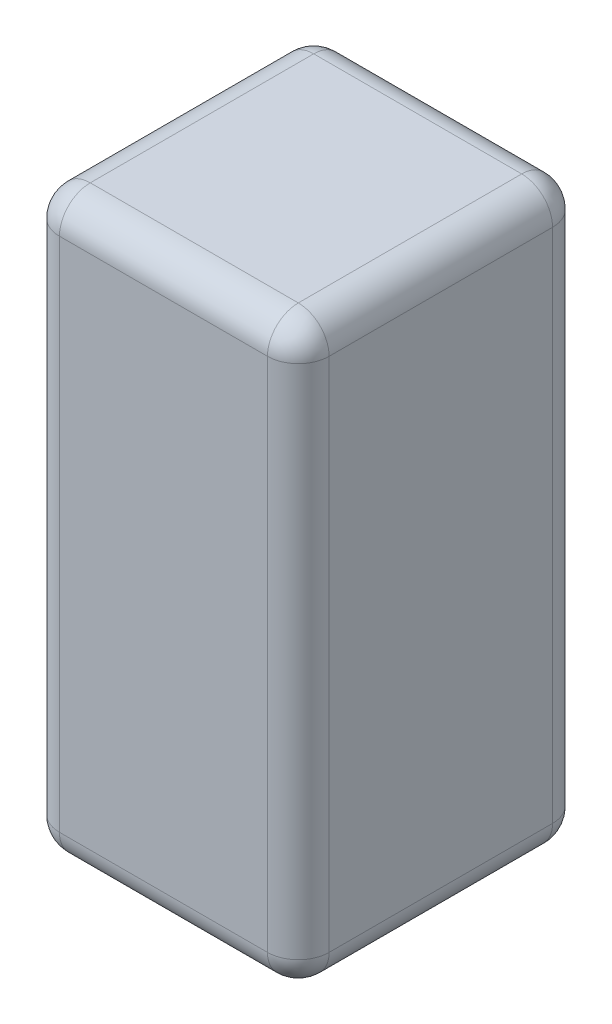
ISO-10303-21;
HEADER;
FILE_DESCRIPTION(('STEP AP214'),'2;1');
FILE_NAME('part.step','',(''),(''),'','','');
FILE_SCHEMA(('AUTOMOTIVE_DESIGN { 1 0 10303 214 1 1 1 1 }'));
ENDSEC;
DATA;
#1=APPLICATION_CONTEXT('core data for automotive mechanical design processes');
#2=APPLICATION_PROTOCOL_DEFINITION('international standard','automotive_design',2000,#1);
#3=PRODUCT_CONTEXT('',#1,'mechanical');
#4=PRODUCT('Part','Part','',(#3));
#5=PRODUCT_RELATED_PRODUCT_CATEGORY('part','',(#4));
#6=PRODUCT_DEFINITION_FORMATION('','',#4);
#7=PRODUCT_DEFINITION_CONTEXT('part definition',#1,'design');
#8=PRODUCT_DEFINITION('design','',#6,#7);
#9=PRODUCT_DEFINITION_SHAPE('','',#8);
#10=(LENGTH_UNIT() NAMED_UNIT(*) SI_UNIT(.MILLI.,.METRE.));
#11=(NAMED_UNIT(*) PLANE_ANGLE_UNIT() SI_UNIT($,.RADIAN.));
#12=(NAMED_UNIT(*) SI_UNIT($,.STERADIAN.) SOLID_ANGLE_UNIT());
#13=UNCERTAINTY_MEASURE_WITH_UNIT(LENGTH_MEASURE(1.E-05),#10,'distance_accuracy_value','');
#14=(GEOMETRIC_REPRESENTATION_CONTEXT(3) GLOBAL_UNCERTAINTY_ASSIGNED_CONTEXT((#13)) GLOBAL_UNIT_ASSIGNED_CONTEXT((#10,
#11,#12)) REPRESENTATION_CONTEXT('',''));
#15=CARTESIAN_POINT('',(0.,0.,0.));
#16=DIRECTION('',(0.,0.,1.));
#17=DIRECTION('',(1.,0.,0.));
#18=AXIS2_PLACEMENT_3D('',#15,#16,#17);
#19=CARTESIAN_POINT('',(17.5,37.5,41.));
#20=DIRECTION('',(-1.,0.,0.));
#21=DIRECTION('',(0.,-1.,0.));
#22=AXIS2_PLACEMENT_3D('',#19,#20,#21);
#23=PLANE('',#22);
#24=DIRECTION('',(0.,1.,0.));
#25=VECTOR('',#24,1.);
#26=CARTESIAN_POINT('',(17.5,37.5,8.));
#27=LINE('',#26,#25);
#28=CARTESIAN_POINT('',(17.5,-33.5,8.));
#29=VERTEX_POINT('',#28);
#30=CARTESIAN_POINT('',(17.5,33.5,8.));
#31=VERTEX_POINT('',#30);
#32=EDGE_CURVE('E132',#29,#31,#27,.T.);
#33=ORIENTED_EDGE('',*,*,#32,.T.);
#34=DIRECTION('',(0.,0.,-1.));
#35=VECTOR('',#34,1.);
#36=CARTESIAN_POINT('',(17.5,33.5,41.));
#37=LINE('',#36,#35);
#38=CARTESIAN_POINT('',(17.5,33.5,37.));
#39=VERTEX_POINT('',#38);
#40=EDGE_CURVE('E128',#31,#39,#37,.F.);
#41=ORIENTED_EDGE('',*,*,#40,.T.);
#42=DIRECTION('',(0.,1.,0.));
#43=VECTOR('',#42,1.);
#44=CARTESIAN_POINT('',(17.5,37.5,37.));
#45=LINE('',#44,#43);
#46=CARTESIAN_POINT('',(17.5,-33.5,37.));
#47=VERTEX_POINT('',#46);
#48=EDGE_CURVE('E121',#39,#47,#45,.F.);
#49=ORIENTED_EDGE('',*,*,#48,.T.);
#50=DIRECTION('',(0.,0.,-1.));
#51=VECTOR('',#50,1.);
#52=CARTESIAN_POINT('',(17.5,-33.5,41.));
#53=LINE('',#52,#51);
#54=EDGE_CURVE('E125',#47,#29,#53,.T.);
#55=ORIENTED_EDGE('',*,*,#54,.T.);
#56=EDGE_LOOP('',(#33,#41,#49,#55));
#57=FACE_BOUND('',#56,.T.);
#58=ADVANCED_FACE('F33',(#57),#23,.F.);
#59=CARTESIAN_POINT('',(17.5,37.5,41.));
#60=DIRECTION('',(0.,-1.,0.));
#61=DIRECTION('',(1.,0.,0.));
#62=AXIS2_PLACEMENT_3D('',#59,#60,#61);
#63=PLANE('',#62);
#64=DIRECTION('',(-1.,0.,0.));
#65=VECTOR('',#64,1.);
#66=CARTESIAN_POINT('',(17.5,37.5,37.));
#67=LINE('',#66,#65);
#68=CARTESIAN_POINT('',(-13.5,37.5,37.));
#69=VERTEX_POINT('',#68);
#70=CARTESIAN_POINT('',(13.5,37.5,37.));
#71=VERTEX_POINT('',#70);
#72=EDGE_CURVE('E42',#69,#71,#67,.F.);
#73=ORIENTED_EDGE('',*,*,#72,.T.);
#74=DIRECTION('',(0.,0.,-1.));
#75=VECTOR('',#74,1.);
#76=CARTESIAN_POINT('',(13.5,37.5,41.));
#77=LINE('',#76,#75);
#78=CARTESIAN_POINT('',(13.5,37.5,8.));
#79=VERTEX_POINT('',#78);
#80=EDGE_CURVE('E11',#71,#79,#77,.T.);
#81=ORIENTED_EDGE('',*,*,#80,.T.);
#82=DIRECTION('',(-1.,0.,0.));
#83=VECTOR('',#82,1.);
#84=CARTESIAN_POINT('',(-17.5,37.5,8.));
#85=LINE('',#84,#83);
#86=CARTESIAN_POINT('',(-13.5,37.5,8.));
#87=VERTEX_POINT('',#86);
#88=EDGE_CURVE('E201',#79,#87,#85,.T.);
#89=ORIENTED_EDGE('',*,*,#88,.T.);
#90=DIRECTION('',(0.,0.,-1.));
#91=VECTOR('',#90,1.);
#92=CARTESIAN_POINT('',(-13.5,37.5,41.));
#93=LINE('',#92,#91);
#94=EDGE_CURVE('E199',#87,#69,#93,.F.);
#95=ORIENTED_EDGE('',*,*,#94,.T.);
#96=EDGE_LOOP('',(#73,#81,#89,#95));
#97=FACE_BOUND('',#96,.T.);
#98=ADVANCED_FACE('F265',(#97),#63,.F.);
#99=CARTESIAN_POINT('',(-17.5,37.5,41.));
#100=DIRECTION('',(1.,0.,0.));
#101=DIRECTION('',(0.,1.,0.));
#102=AXIS2_PLACEMENT_3D('',#99,#100,#101);
#103=PLANE('',#102);
#104=DIRECTION('',(0.,-1.,0.));
#105=VECTOR('',#104,1.);
#106=CARTESIAN_POINT('',(-17.5,37.5,37.));
#107=LINE('',#106,#105);
#108=CARTESIAN_POINT('',(-17.5,-33.5,37.));
#109=VERTEX_POINT('',#108);
#110=CARTESIAN_POINT('',(-17.5,33.5,37.));
#111=VERTEX_POINT('',#110);
#112=EDGE_CURVE('E192',#109,#111,#107,.F.);
#113=ORIENTED_EDGE('',*,*,#112,.T.);
#114=DIRECTION('',(0.,0.,-1.));
#115=VECTOR('',#114,1.);
#116=CARTESIAN_POINT('',(-17.5,33.5,41.));
#117=LINE('',#116,#115);
#118=CARTESIAN_POINT('',(-17.5,33.5,8.));
#119=VERTEX_POINT('',#118);
#120=EDGE_CURVE('E197',#111,#119,#117,.T.);
#121=ORIENTED_EDGE('',*,*,#120,.T.);
#122=DIRECTION('',(0.,-1.,0.));
#123=VECTOR('',#122,1.);
#124=CARTESIAN_POINT('',(-17.5,-37.5,8.));
#125=LINE('',#124,#123);
#126=CARTESIAN_POINT('',(-17.5,-33.5,8.));
#127=VERTEX_POINT('',#126);
#128=EDGE_CURVE('E194',#119,#127,#125,.T.);
#129=ORIENTED_EDGE('',*,*,#128,.T.);
#130=DIRECTION('',(0.,0.,-1.));
#131=VECTOR('',#130,1.);
#132=CARTESIAN_POINT('',(-17.5,-33.5,41.));
#133=LINE('',#132,#131);
#134=EDGE_CURVE('E190',#127,#109,#133,.F.);
#135=ORIENTED_EDGE('',*,*,#134,.T.);
#136=EDGE_LOOP('',(#113,#121,#129,#135));
#137=FACE_BOUND('',#136,.T.);
#138=ADVANCED_FACE('F272',(#137),#103,.F.);
#139=CARTESIAN_POINT('',(17.5,-37.5,41.));
#140=DIRECTION('',(0.,1.,0.));
#141=DIRECTION('',(-1.,0.,0.));
#142=AXIS2_PLACEMENT_3D('',#139,#140,#141);
#143=PLANE('',#142);
#144=DIRECTION('',(1.,0.,0.));
#145=VECTOR('',#144,1.);
#146=CARTESIAN_POINT('',(17.5,-37.5,8.));
#147=LINE('',#146,#145);
#148=CARTESIAN_POINT('',(-13.5,-37.5,8.));
#149=VERTEX_POINT('',#148);
#150=CARTESIAN_POINT('',(13.5,-37.5,8.));
#151=VERTEX_POINT('',#150);
#152=EDGE_CURVE('E183',#149,#151,#147,.T.);
#153=ORIENTED_EDGE('',*,*,#152,.T.);
#154=DIRECTION('',(0.,0.,-1.));
#155=VECTOR('',#154,1.);
#156=CARTESIAN_POINT('',(13.5,-37.5,41.));
#157=LINE('',#156,#155);
#158=CARTESIAN_POINT('',(13.5,-37.5,37.));
#159=VERTEX_POINT('',#158);
#160=EDGE_CURVE('E188',#151,#159,#157,.F.);
#161=ORIENTED_EDGE('',*,*,#160,.T.);
#162=DIRECTION('',(1.,0.,0.));
#163=VECTOR('',#162,1.);
#164=CARTESIAN_POINT('',(17.5,-37.5,37.));
#165=LINE('',#164,#163);
#166=CARTESIAN_POINT('',(-13.5,-37.5,37.));
#167=VERTEX_POINT('',#166);
#168=EDGE_CURVE('E185',#159,#167,#165,.F.);
#169=ORIENTED_EDGE('',*,*,#168,.T.);
#170=DIRECTION('',(0.,0.,-1.));
#171=VECTOR('',#170,1.);
#172=CARTESIAN_POINT('',(-13.5,-37.5,41.));
#173=LINE('',#172,#171);
#174=EDGE_CURVE('E181',#167,#149,#173,.T.);
#175=ORIENTED_EDGE('',*,*,#174,.T.);
#176=EDGE_LOOP('',(#153,#161,#169,#175));
#177=FACE_BOUND('',#176,.T.);
#178=ADVANCED_FACE('F298',(#177),#143,.F.);
#179=CARTESIAN_POINT('',(0.,0.,41.));
#180=DIRECTION('',(0.,0.,-1.));
#181=DIRECTION('',(-1.,0.,0.));
#182=AXIS2_PLACEMENT_3D('',#179,#180,#181);
#183=PLANE('',#182);
#184=DIRECTION('',(1.,0.,0.));
#185=VECTOR('',#184,1.);
#186=CARTESIAN_POINT('',(0.,-33.5,41.));
#187=LINE('',#186,#185);
#188=CARTESIAN_POINT('',(-13.5,-33.5,41.));
#189=VERTEX_POINT('',#188);
#190=CARTESIAN_POINT('',(13.5,-33.5,41.));
#191=VERTEX_POINT('',#190);
#192=EDGE_CURVE('E178',#189,#191,#187,.T.);
#193=ORIENTED_EDGE('',*,*,#192,.T.);
#194=DIRECTION('',(0.,1.,0.));
#195=VECTOR('',#194,1.);
#196=CARTESIAN_POINT('',(13.5,0.,41.));
#197=LINE('',#196,#195);
#198=CARTESIAN_POINT('',(13.5,33.5,41.));
#199=VERTEX_POINT('',#198);
#200=EDGE_CURVE('E140',#191,#199,#197,.T.);
#201=ORIENTED_EDGE('',*,*,#200,.T.);
#202=DIRECTION('',(-1.,0.,0.));
#203=VECTOR('',#202,1.);
#204=CARTESIAN_POINT('',(0.,33.5,41.));
#205=LINE('',#204,#203);
#206=CARTESIAN_POINT('',(-13.5,33.5,41.));
#207=VERTEX_POINT('',#206);
#208=EDGE_CURVE('E174',#199,#207,#205,.T.);
#209=ORIENTED_EDGE('',*,*,#208,.T.);
#210=DIRECTION('',(0.,-1.,0.));
#211=VECTOR('',#210,1.);
#212=CARTESIAN_POINT('',(-13.5,0.,41.));
#213=LINE('',#212,#211);
#214=EDGE_CURVE('E176',#207,#189,#213,.T.);
#215=ORIENTED_EDGE('',*,*,#214,.T.);
#216=EDGE_LOOP('',(#193,#201,#209,#215));
#217=FACE_BOUND('',#216,.T.);
#218=ADVANCED_FACE('F295',(#217),#183,.F.);
#219=CARTESIAN_POINT('',(0.,0.,4.));
#220=DIRECTION('',(0.,0.,-1.));
#221=DIRECTION('',(-1.,0.,0.));
#222=AXIS2_PLACEMENT_3D('',#219,#220,#221);
#223=PLANE('',#222);
#224=DIRECTION('',(-1.,0.,0.));
#225=VECTOR('',#224,1.);
#226=CARTESIAN_POINT('',(17.5,33.5,4.));
#227=LINE('',#226,#225);
#228=CARTESIAN_POINT('',(-13.5,33.5,4.));
#229=VERTEX_POINT('',#228);
#230=CARTESIAN_POINT('',(13.5,33.5,4.));
#231=VERTEX_POINT('',#230);
#232=EDGE_CURVE('E165',#229,#231,#227,.F.);
#233=ORIENTED_EDGE('',*,*,#232,.T.);
#234=DIRECTION('',(0.,1.,0.));
#235=VECTOR('',#234,1.);
#236=CARTESIAN_POINT('',(13.5,-37.5,4.));
#237=LINE('',#236,#235);
#238=CARTESIAN_POINT('',(13.5,-33.5,4.));
#239=VERTEX_POINT('',#238);
#240=EDGE_CURVE('E171',#231,#239,#237,.F.);
#241=ORIENTED_EDGE('',*,*,#240,.T.);
#242=DIRECTION('',(1.,0.,0.));
#243=VECTOR('',#242,1.);
#244=CARTESIAN_POINT('',(-17.5,-33.5,4.));
#245=LINE('',#244,#243);
#246=CARTESIAN_POINT('',(-13.5,-33.5,4.));
#247=VERTEX_POINT('',#246);
#248=EDGE_CURVE('E169',#239,#247,#245,.F.);
#249=ORIENTED_EDGE('',*,*,#248,.T.);
#250=DIRECTION('',(0.,-1.,0.));
#251=VECTOR('',#250,1.);
#252=CARTESIAN_POINT('',(-13.5,37.5,4.));
#253=LINE('',#252,#251);
#254=EDGE_CURVE('E167',#247,#229,#253,.F.);
#255=ORIENTED_EDGE('',*,*,#254,.T.);
#256=EDGE_LOOP('',(#233,#241,#249,#255));
#257=FACE_BOUND('',#256,.T.);
#258=ADVANCED_FACE('F297',(#257),#223,.T.);
#259=CARTESIAN_POINT('',(-13.5,0.,37.));
#260=DIRECTION('',(0.,-1.,0.));
#261=DIRECTION('',(1.,0.,0.));
#262=AXIS2_PLACEMENT_3D('',#259,#260,#261);
#263=CYLINDRICAL_SURFACE('',#262,4.);
#264=CARTESIAN_POINT('',(-13.5,-33.5,37.));
#265=DIRECTION('',(0.,-1.,0.));
#266=DIRECTION('',(0.,0.,-1.));
#267=AXIS2_PLACEMENT_3D('',#264,#265,#266);
#268=CIRCLE('',#267,4.);
#269=EDGE_CURVE('E37',#189,#109,#268,.T.);
#270=ORIENTED_EDGE('',*,*,#269,.F.);
#271=ORIENTED_EDGE('',*,*,#214,.F.);
#272=CARTESIAN_POINT('',(-13.5,33.5,37.));
#273=DIRECTION('',(0.,1.,0.));
#274=DIRECTION('',(0.,0.,1.));
#275=AXIS2_PLACEMENT_3D('',#272,#273,#274);
#276=CIRCLE('',#275,4.);
#277=EDGE_CURVE('E161',#111,#207,#276,.T.);
#278=ORIENTED_EDGE('',*,*,#277,.F.);
#279=ORIENTED_EDGE('',*,*,#112,.F.);
#280=EDGE_LOOP('',(#270,#271,#278,#279));
#281=FACE_BOUND('',#280,.T.);
#282=ADVANCED_FACE('F35',(#281),#263,.T.);
#283=CARTESIAN_POINT('',(-13.5,-33.5,37.));
#284=DIRECTION('',(-1.,0.,0.));
#285=DIRECTION('',(0.,0.,1.));
#286=AXIS2_PLACEMENT_3D('',#283,#284,#285);
#287=SPHERICAL_SURFACE('',#286,4.);
#288=CARTESIAN_POINT('',(-13.5,-33.5,37.));
#289=DIRECTION('',(-1.,0.,0.));
#290=DIRECTION('',(0.,0.,1.));
#291=AXIS2_PLACEMENT_3D('',#288,#289,#290);
#292=CIRCLE('',#291,4.);
#293=EDGE_CURVE('E245',#189,#167,#292,.F.);
#294=ORIENTED_EDGE('',*,*,#293,.F.);
#295=ORIENTED_EDGE('',*,*,#269,.T.);
#296=CARTESIAN_POINT('',(-13.5,-33.5,37.));
#297=DIRECTION('',(0.,0.,1.));
#298=DIRECTION('',(1.,0.,0.));
#299=AXIS2_PLACEMENT_3D('',#296,#297,#298);
#300=CIRCLE('',#299,4.);
#301=EDGE_CURVE('E248',#167,#109,#300,.F.);
#302=ORIENTED_EDGE('',*,*,#301,.F.);
#303=EDGE_LOOP('',(#294,#295,#302));
#304=FACE_BOUND('',#303,.T.);
#305=ADVANCED_FACE('F289',(#304),#287,.T.);
#306=CARTESIAN_POINT('',(-13.5,33.5,37.));
#307=DIRECTION('',(0.,0.,1.));
#308=DIRECTION('',(0.,-1.,0.));
#309=AXIS2_PLACEMENT_3D('',#306,#307,#308);
#310=SPHERICAL_SURFACE('',#309,4.);
#311=CARTESIAN_POINT('',(-13.5,33.5,37.));
#312=DIRECTION('',(0.,0.,1.));
#313=DIRECTION('',(1.,0.,0.));
#314=AXIS2_PLACEMENT_3D('',#311,#312,#313);
#315=CIRCLE('',#314,4.);
#316=EDGE_CURVE('E239',#111,#69,#315,.F.);
#317=ORIENTED_EDGE('',*,*,#316,.F.);
#318=ORIENTED_EDGE('',*,*,#277,.T.);
#319=CARTESIAN_POINT('',(-13.5,33.5,37.));
#320=DIRECTION('',(-1.,0.,0.));
#321=DIRECTION('',(0.,0.,1.));
#322=AXIS2_PLACEMENT_3D('',#319,#320,#321);
#323=CIRCLE('',#322,4.);
#324=EDGE_CURVE('E242',#69,#207,#323,.F.);
#325=ORIENTED_EDGE('',*,*,#324,.F.);
#326=EDGE_LOOP('',(#317,#318,#325));
#327=FACE_BOUND('',#326,.T.);
#328=ADVANCED_FACE('F255',(#327),#310,.T.);
#329=CARTESIAN_POINT('',(-13.5,-33.5,41.));
#330=DIRECTION('',(0.,0.,-1.));
#331=DIRECTION('',(-1.,0.,0.));
#332=AXIS2_PLACEMENT_3D('',#329,#330,#331);
#333=CYLINDRICAL_SURFACE('',#332,4.);
#334=ORIENTED_EDGE('',*,*,#301,.T.);
#335=ORIENTED_EDGE('',*,*,#134,.F.);
#336=CARTESIAN_POINT('',(-13.5,-33.5,8.));
#337=DIRECTION('',(0.,0.,-1.));
#338=DIRECTION('',(-1.,0.,0.));
#339=AXIS2_PLACEMENT_3D('',#336,#337,#338);
#340=CIRCLE('',#339,4.);
#341=EDGE_CURVE('E234',#149,#127,#340,.T.);
#342=ORIENTED_EDGE('',*,*,#341,.F.);
#343=ORIENTED_EDGE('',*,*,#174,.F.);
#344=EDGE_LOOP('',(#334,#335,#342,#343));
#345=FACE_BOUND('',#344,.T.);
#346=ADVANCED_FACE('F284',(#345),#333,.T.);
#347=CARTESIAN_POINT('',(0.,-33.5,37.));
#348=DIRECTION('',(1.,0.,0.));
#349=DIRECTION('',(0.,1.,0.));
#350=AXIS2_PLACEMENT_3D('',#347,#348,#349);
#351=CYLINDRICAL_SURFACE('',#350,4.);
#352=ORIENTED_EDGE('',*,*,#293,.T.);
#353=ORIENTED_EDGE('',*,*,#168,.F.);
#354=CARTESIAN_POINT('',(13.5,-33.5,37.));
#355=DIRECTION('',(1.,0.,0.));
#356=DIRECTION('',(0.,0.,-1.));
#357=AXIS2_PLACEMENT_3D('',#354,#355,#356);
#358=CIRCLE('',#357,4.);
#359=EDGE_CURVE('E144',#191,#159,#358,.T.);
#360=ORIENTED_EDGE('',*,*,#359,.F.);
#361=ORIENTED_EDGE('',*,*,#192,.F.);
#362=EDGE_LOOP('',(#352,#353,#360,#361));
#363=FACE_BOUND('',#362,.T.);
#364=ADVANCED_FACE('F293',(#363),#351,.T.);
#365=CARTESIAN_POINT('',(13.5,0.,37.));
#366=DIRECTION('',(0.,1.,0.));
#367=DIRECTION('',(-1.,0.,0.));
#368=AXIS2_PLACEMENT_3D('',#365,#366,#367);
#369=CYLINDRICAL_SURFACE('',#368,4.);
#370=CARTESIAN_POINT('',(13.5,33.5,37.));
#371=DIRECTION('',(0.,1.,0.));
#372=DIRECTION('',(-1.,0.,0.));
#373=AXIS2_PLACEMENT_3D('',#370,#371,#372);
#374=CIRCLE('',#373,4.);
#375=EDGE_CURVE('E145',#199,#39,#374,.T.);
#376=ORIENTED_EDGE('',*,*,#375,.F.);
#377=ORIENTED_EDGE('',*,*,#200,.F.);
#378=CARTESIAN_POINT('',(13.5,-33.5,37.));
#379=DIRECTION('',(0.,-1.,0.));
#380=DIRECTION('',(0.,0.,-1.));
#381=AXIS2_PLACEMENT_3D('',#378,#379,#380);
#382=CIRCLE('',#381,4.);
#383=EDGE_CURVE('E136',#47,#191,#382,.T.);
#384=ORIENTED_EDGE('',*,*,#383,.F.);
#385=ORIENTED_EDGE('',*,*,#48,.F.);
#386=EDGE_LOOP('',(#376,#377,#384,#385));
#387=FACE_BOUND('',#386,.T.);
#388=ADVANCED_FACE('F138',(#387),#369,.T.);
#389=CARTESIAN_POINT('',(0.,33.5,37.));
#390=DIRECTION('',(-1.,0.,0.));
#391=DIRECTION('',(0.,-1.,0.));
#392=AXIS2_PLACEMENT_3D('',#389,#390,#391);
#393=CYLINDRICAL_SURFACE('',#392,4.);
#394=ORIENTED_EDGE('',*,*,#324,.T.);
#395=ORIENTED_EDGE('',*,*,#208,.F.);
#396=CARTESIAN_POINT('',(13.5,33.5,37.));
#397=DIRECTION('',(1.,0.,0.));
#398=DIRECTION('',(0.,0.,-1.));
#399=AXIS2_PLACEMENT_3D('',#396,#397,#398);
#400=CIRCLE('',#399,4.);
#401=EDGE_CURVE('E230',#71,#199,#400,.T.);
#402=ORIENTED_EDGE('',*,*,#401,.F.);
#403=ORIENTED_EDGE('',*,*,#72,.F.);
#404=EDGE_LOOP('',(#394,#395,#402,#403));
#405=FACE_BOUND('',#404,.T.);
#406=ADVANCED_FACE('F263',(#405),#393,.T.);
#407=CARTESIAN_POINT('',(-13.5,33.5,41.));
#408=DIRECTION('',(0.,0.,-1.));
#409=DIRECTION('',(-1.,0.,0.));
#410=AXIS2_PLACEMENT_3D('',#407,#408,#409);
#411=CYLINDRICAL_SURFACE('',#410,4.);
#412=ORIENTED_EDGE('',*,*,#316,.T.);
#413=ORIENTED_EDGE('',*,*,#94,.F.);
#414=CARTESIAN_POINT('',(-13.5,33.5,8.));
#415=DIRECTION('',(0.,0.,-1.));
#416=DIRECTION('',(-1.,0.,0.));
#417=AXIS2_PLACEMENT_3D('',#414,#415,#416);
#418=CIRCLE('',#417,4.);
#419=EDGE_CURVE('E227',#119,#87,#418,.T.);
#420=ORIENTED_EDGE('',*,*,#419,.F.);
#421=ORIENTED_EDGE('',*,*,#120,.F.);
#422=EDGE_LOOP('',(#412,#413,#420,#421));
#423=FACE_BOUND('',#422,.T.);
#424=ADVANCED_FACE('F269',(#423),#411,.T.);
#425=CARTESIAN_POINT('',(-13.5,37.5,8.));
#426=DIRECTION('',(0.,1.,0.));
#427=DIRECTION('',(-1.,0.,0.));
#428=AXIS2_PLACEMENT_3D('',#425,#426,#427);
#429=CYLINDRICAL_SURFACE('',#428,4.);
#430=CARTESIAN_POINT('',(-13.5,-33.5,8.));
#431=DIRECTION('',(0.,-1.,0.));
#432=DIRECTION('',(0.,0.,-1.));
#433=AXIS2_PLACEMENT_3D('',#430,#431,#432);
#434=CIRCLE('',#433,4.);
#435=EDGE_CURVE('E236',#127,#247,#434,.T.);
#436=ORIENTED_EDGE('',*,*,#435,.F.);
#437=ORIENTED_EDGE('',*,*,#128,.F.);
#438=CARTESIAN_POINT('',(-13.5,33.5,8.));
#439=DIRECTION('',(0.,1.,0.));
#440=DIRECTION('',(0.,0.,1.));
#441=AXIS2_PLACEMENT_3D('',#438,#439,#440);
#442=CIRCLE('',#441,4.);
#443=EDGE_CURVE('E224',#229,#119,#442,.T.);
#444=ORIENTED_EDGE('',*,*,#443,.F.);
#445=ORIENTED_EDGE('',*,*,#254,.F.);
#446=EDGE_LOOP('',(#436,#437,#444,#445));
#447=FACE_BOUND('',#446,.T.);
#448=ADVANCED_FACE('F276',(#447),#429,.T.);
#449=CARTESIAN_POINT('',(-13.5,-33.5,8.));
#450=DIRECTION('',(-1.,0.,0.));
#451=DIRECTION('',(0.,0.,1.));
#452=AXIS2_PLACEMENT_3D('',#449,#450,#451);
#453=SPHERICAL_SURFACE('',#452,4.);
#454=ORIENTED_EDGE('',*,*,#341,.T.);
#455=ORIENTED_EDGE('',*,*,#435,.T.);
#456=CARTESIAN_POINT('',(-13.5,-33.5,8.));
#457=DIRECTION('',(-1.,0.,0.));
#458=DIRECTION('',(0.,0.,1.));
#459=AXIS2_PLACEMENT_3D('',#456,#457,#458);
#460=CIRCLE('',#459,4.);
#461=EDGE_CURVE('E152',#149,#247,#460,.F.);
#462=ORIENTED_EDGE('',*,*,#461,.F.);
#463=EDGE_LOOP('',(#454,#455,#462));
#464=FACE_BOUND('',#463,.T.);
#465=ADVANCED_FACE('F351',(#464),#453,.T.);
#466=CARTESIAN_POINT('',(13.5,-33.5,37.));
#467=DIRECTION('',(0.,0.,1.));
#468=DIRECTION('',(1.,0.,0.));
#469=AXIS2_PLACEMENT_3D('',#466,#467,#468);
#470=SPHERICAL_SURFACE('',#469,4.);
#471=ORIENTED_EDGE('',*,*,#383,.T.);
#472=ORIENTED_EDGE('',*,*,#359,.T.);
#473=CARTESIAN_POINT('',(13.5,-33.5,37.));
#474=DIRECTION('',(0.,0.,1.));
#475=DIRECTION('',(1.,0.,0.));
#476=AXIS2_PLACEMENT_3D('',#473,#474,#475);
#477=CIRCLE('',#476,4.);
#478=EDGE_CURVE('E148',#47,#159,#477,.F.);
#479=ORIENTED_EDGE('',*,*,#478,.F.);
#480=EDGE_LOOP('',(#471,#472,#479));
#481=FACE_BOUND('',#480,.T.);
#482=ADVANCED_FACE('F149',(#481),#470,.T.);
#483=CARTESIAN_POINT('',(13.5,33.5,37.));
#484=DIRECTION('',(0.,0.,1.));
#485=DIRECTION('',(0.,-1.,0.));
#486=AXIS2_PLACEMENT_3D('',#483,#484,#485);
#487=SPHERICAL_SURFACE('',#486,4.);
#488=ORIENTED_EDGE('',*,*,#401,.T.);
#489=ORIENTED_EDGE('',*,*,#375,.T.);
#490=CARTESIAN_POINT('',(13.5,33.5,37.));
#491=DIRECTION('',(0.,0.,1.));
#492=DIRECTION('',(1.,0.,0.));
#493=AXIS2_PLACEMENT_3D('',#490,#491,#492);
#494=CIRCLE('',#493,4.);
#495=EDGE_CURVE('E153',#71,#39,#494,.F.);
#496=ORIENTED_EDGE('',*,*,#495,.F.);
#497=EDGE_LOOP('',(#488,#489,#496));
#498=FACE_BOUND('',#497,.T.);
#499=ADVANCED_FACE('F344',(#498),#487,.T.);
#500=CARTESIAN_POINT('',(-13.5,33.5,8.));
#501=DIRECTION('',(-1.,0.,0.));
#502=DIRECTION('',(0.,0.,1.));
#503=AXIS2_PLACEMENT_3D('',#500,#501,#502);
#504=SPHERICAL_SURFACE('',#503,4.);
#505=ORIENTED_EDGE('',*,*,#443,.T.);
#506=ORIENTED_EDGE('',*,*,#419,.T.);
#507=CARTESIAN_POINT('',(-13.5,33.5,8.));
#508=DIRECTION('',(-1.,0.,0.));
#509=DIRECTION('',(0.,0.,1.));
#510=AXIS2_PLACEMENT_3D('',#507,#508,#509);
#511=CIRCLE('',#510,4.);
#512=EDGE_CURVE('E218',#229,#87,#511,.F.);
#513=ORIENTED_EDGE('',*,*,#512,.F.);
#514=EDGE_LOOP('',(#505,#506,#513));
#515=FACE_BOUND('',#514,.T.);
#516=ADVANCED_FACE('F340',(#515),#504,.T.);
#517=CARTESIAN_POINT('',(17.5,-33.5,8.));
#518=DIRECTION('',(-1.,0.,0.));
#519=DIRECTION('',(0.,-1.,0.));
#520=AXIS2_PLACEMENT_3D('',#517,#518,#519);
#521=CYLINDRICAL_SURFACE('',#520,4.);
#522=ORIENTED_EDGE('',*,*,#461,.T.);
#523=ORIENTED_EDGE('',*,*,#248,.F.);
#524=CARTESIAN_POINT('',(13.5,-33.5,8.));
#525=DIRECTION('',(1.,0.,0.));
#526=DIRECTION('',(0.,0.,-1.));
#527=AXIS2_PLACEMENT_3D('',#524,#525,#526);
#528=CIRCLE('',#527,4.);
#529=EDGE_CURVE('E215',#151,#239,#528,.T.);
#530=ORIENTED_EDGE('',*,*,#529,.F.);
#531=ORIENTED_EDGE('',*,*,#152,.F.);
#532=EDGE_LOOP('',(#522,#523,#530,#531));
#533=FACE_BOUND('',#532,.T.);
#534=ADVANCED_FACE('F337',(#533),#521,.T.);
#535=CARTESIAN_POINT('',(13.5,-33.5,41.));
#536=DIRECTION('',(0.,0.,-1.));
#537=DIRECTION('',(-1.,0.,0.));
#538=AXIS2_PLACEMENT_3D('',#535,#536,#537);
#539=CYLINDRICAL_SURFACE('',#538,4.);
#540=ORIENTED_EDGE('',*,*,#478,.T.);
#541=ORIENTED_EDGE('',*,*,#160,.F.);
#542=CARTESIAN_POINT('',(13.5,-33.5,8.));
#543=DIRECTION('',(0.,0.,-1.));
#544=DIRECTION('',(-1.,0.,0.));
#545=AXIS2_PLACEMENT_3D('',#542,#543,#544);
#546=CIRCLE('',#545,4.);
#547=EDGE_CURVE('E157',#29,#151,#546,.T.);
#548=ORIENTED_EDGE('',*,*,#547,.F.);
#549=ORIENTED_EDGE('',*,*,#54,.F.);
#550=EDGE_LOOP('',(#540,#541,#548,#549));
#551=FACE_BOUND('',#550,.T.);
#552=ADVANCED_FACE('F155',(#551),#539,.T.);
#553=CARTESIAN_POINT('',(13.5,33.5,41.));
#554=DIRECTION('',(0.,0.,-1.));
#555=DIRECTION('',(-1.,0.,0.));
#556=AXIS2_PLACEMENT_3D('',#553,#554,#555);
#557=CYLINDRICAL_SURFACE('',#556,4.);
#558=ORIENTED_EDGE('',*,*,#495,.T.);
#559=ORIENTED_EDGE('',*,*,#40,.F.);
#560=CARTESIAN_POINT('',(13.5,33.5,8.));
#561=DIRECTION('',(0.,0.,-1.));
#562=DIRECTION('',(-1.,0.,0.));
#563=AXIS2_PLACEMENT_3D('',#560,#561,#562);
#564=CIRCLE('',#563,4.);
#565=EDGE_CURVE('E211',#79,#31,#564,.T.);
#566=ORIENTED_EDGE('',*,*,#565,.F.);
#567=ORIENTED_EDGE('',*,*,#80,.F.);
#568=EDGE_LOOP('',(#558,#559,#566,#567));
#569=FACE_BOUND('',#568,.T.);
#570=ADVANCED_FACE('F331',(#569),#557,.T.);
#571=CARTESIAN_POINT('',(17.5,33.5,8.));
#572=DIRECTION('',(1.,0.,0.));
#573=DIRECTION('',(0.,1.,0.));
#574=AXIS2_PLACEMENT_3D('',#571,#572,#573);
#575=CYLINDRICAL_SURFACE('',#574,4.);
#576=ORIENTED_EDGE('',*,*,#512,.T.);
#577=ORIENTED_EDGE('',*,*,#88,.F.);
#578=CARTESIAN_POINT('',(13.5,33.5,8.));
#579=DIRECTION('',(1.,0.,0.));
#580=DIRECTION('',(0.,0.,-1.));
#581=AXIS2_PLACEMENT_3D('',#578,#579,#580);
#582=CIRCLE('',#581,4.);
#583=EDGE_CURVE('E208',#231,#79,#582,.T.);
#584=ORIENTED_EDGE('',*,*,#583,.F.);
#585=ORIENTED_EDGE('',*,*,#232,.F.);
#586=EDGE_LOOP('',(#576,#577,#584,#585));
#587=FACE_BOUND('',#586,.T.);
#588=ADVANCED_FACE('F327',(#587),#575,.T.);
#589=CARTESIAN_POINT('',(13.5,-33.5,8.));
#590=DIRECTION('',(0.,-1.,0.));
#591=DIRECTION('',(0.,0.,-1.));
#592=AXIS2_PLACEMENT_3D('',#589,#590,#591);
#593=SPHERICAL_SURFACE('',#592,4.);
#594=ORIENTED_EDGE('',*,*,#547,.T.);
#595=ORIENTED_EDGE('',*,*,#529,.T.);
#596=CARTESIAN_POINT('',(13.5,-33.5,8.));
#597=DIRECTION('',(0.,-1.,0.));
#598=DIRECTION('',(1.,0.,0.));
#599=AXIS2_PLACEMENT_3D('',#596,#597,#598);
#600=CIRCLE('',#599,4.);
#601=EDGE_CURVE('E206',#29,#239,#600,.F.);
#602=ORIENTED_EDGE('',*,*,#601,.F.);
#603=EDGE_LOOP('',(#594,#595,#602));
#604=FACE_BOUND('',#603,.T.);
#605=ADVANCED_FACE('F323',(#604),#593,.T.);
#606=CARTESIAN_POINT('',(13.5,33.5,8.));
#607=DIRECTION('',(0.,1.,0.));
#608=DIRECTION('',(0.,0.,1.));
#609=AXIS2_PLACEMENT_3D('',#606,#607,#608);
#610=SPHERICAL_SURFACE('',#609,4.);
#611=ORIENTED_EDGE('',*,*,#583,.T.);
#612=ORIENTED_EDGE('',*,*,#565,.T.);
#613=CARTESIAN_POINT('',(13.5,33.5,8.));
#614=DIRECTION('',(0.,1.,0.));
#615=DIRECTION('',(0.,0.,1.));
#616=AXIS2_PLACEMENT_3D('',#613,#614,#615);
#617=CIRCLE('',#616,4.);
#618=EDGE_CURVE('E204',#231,#31,#617,.F.);
#619=ORIENTED_EDGE('',*,*,#618,.F.);
#620=EDGE_LOOP('',(#611,#612,#619));
#621=FACE_BOUND('',#620,.T.);
#622=ADVANCED_FACE('F319',(#621),#610,.T.);
#623=CARTESIAN_POINT('',(13.5,37.5,8.));
#624=DIRECTION('',(0.,-1.,0.));
#625=DIRECTION('',(1.,0.,0.));
#626=AXIS2_PLACEMENT_3D('',#623,#624,#625);
#627=CYLINDRICAL_SURFACE('',#626,4.);
#628=ORIENTED_EDGE('',*,*,#601,.T.);
#629=ORIENTED_EDGE('',*,*,#240,.F.);
#630=ORIENTED_EDGE('',*,*,#618,.T.);
#631=ORIENTED_EDGE('',*,*,#32,.F.);
#632=EDGE_LOOP('',(#628,#629,#630,#631));
#633=FACE_BOUND('',#632,.T.);
#634=ADVANCED_FACE('F316',(#633),#627,.T.);
#635=CLOSED_SHELL('',(#58,#98,#138,#178,#218,#258,#282,#305,#328,#346,#364,#388,#406,#424,#448,
#465,#482,#499,#516,#534,#552,#570,#588,#605,#622,#634));
#636=MANIFOLD_SOLID_BREP('B2',#635);
#637=ADVANCED_BREP_SHAPE_REPRESENTATION('',(#18,#636),#14);
#638=SHAPE_DEFINITION_REPRESENTATION(#9,#637);
ENDSEC;
END-ISO-10303-21;
